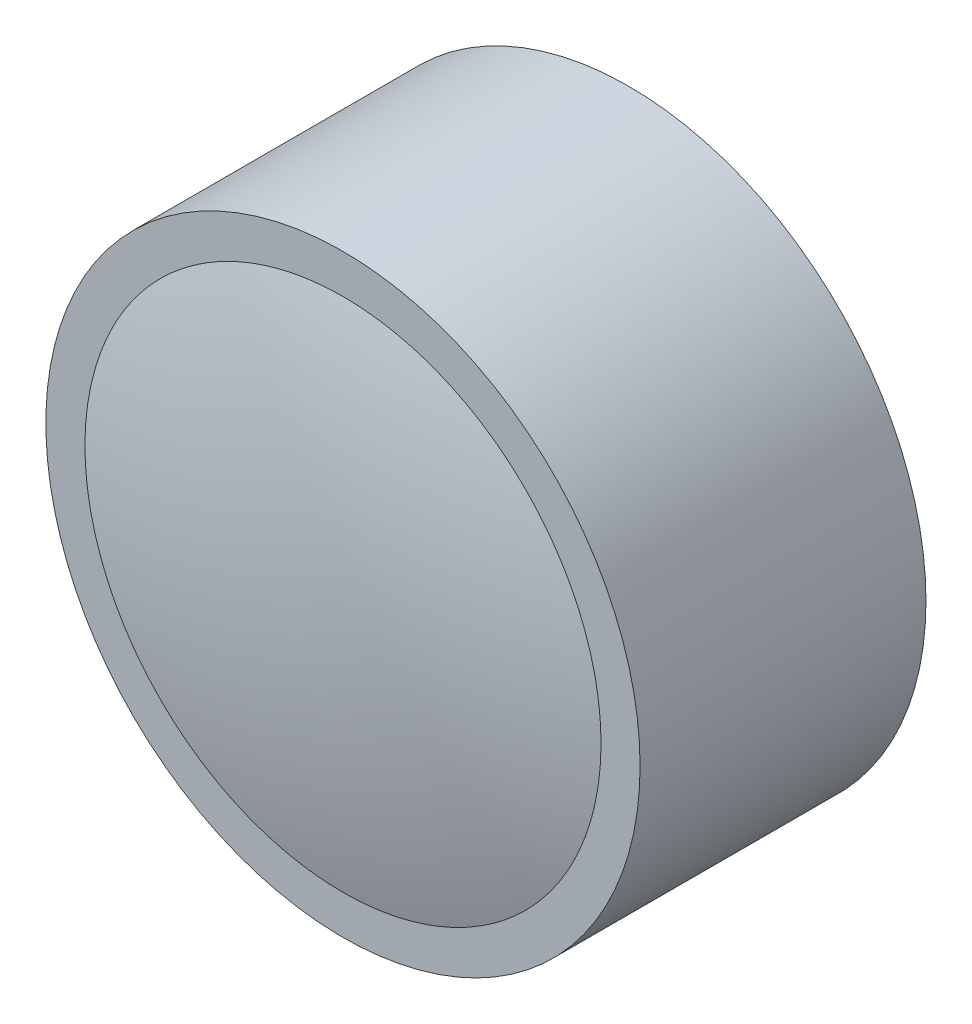
ISO-10303-21;
HEADER;
FILE_DESCRIPTION(('STEP AP214'),'2;1');
FILE_NAME('part.step','',(''),(''),'','','');
FILE_SCHEMA(('AUTOMOTIVE_DESIGN { 1 0 10303 214 1 1 1 1 }'));
ENDSEC;
DATA;
#1=APPLICATION_CONTEXT('core data for automotive mechanical design processes');
#2=APPLICATION_PROTOCOL_DEFINITION('international standard','automotive_design',2000,#1);
#3=PRODUCT_CONTEXT('',#1,'mechanical');
#4=PRODUCT('Part','Part','',(#3));
#5=PRODUCT_RELATED_PRODUCT_CATEGORY('part','',(#4));
#6=PRODUCT_DEFINITION_FORMATION('','',#4);
#7=PRODUCT_DEFINITION_CONTEXT('part definition',#1,'design');
#8=PRODUCT_DEFINITION('design','',#6,#7);
#9=PRODUCT_DEFINITION_SHAPE('','',#8);
#10=(LENGTH_UNIT() NAMED_UNIT(*) SI_UNIT(.MILLI.,.METRE.));
#11=(NAMED_UNIT(*) PLANE_ANGLE_UNIT() SI_UNIT($,.RADIAN.));
#12=(NAMED_UNIT(*) SI_UNIT($,.STERADIAN.) SOLID_ANGLE_UNIT());
#13=UNCERTAINTY_MEASURE_WITH_UNIT(LENGTH_MEASURE(1.E-05),#10,'distance_accuracy_value','');
#14=(GEOMETRIC_REPRESENTATION_CONTEXT(3) GLOBAL_UNCERTAINTY_ASSIGNED_CONTEXT((#13)) GLOBAL_UNIT_ASSIGNED_CONTEXT((#10,
#11,#12)) REPRESENTATION_CONTEXT('',''));
#15=CARTESIAN_POINT('',(0.,0.,0.));
#16=DIRECTION('',(0.,0.,1.));
#17=DIRECTION('',(1.,0.,0.));
#18=AXIS2_PLACEMENT_3D('',#15,#16,#17);
#19=CARTESIAN_POINT('',(0.,0.,0.));
#20=DIRECTION('',(0.,0.,1.));
#21=DIRECTION('',(1.,0.,0.));
#22=AXIS2_PLACEMENT_3D('',#19,#20,#21);
#23=SPHERICAL_SURFACE('',#22,30.);
#24=CARTESIAN_POINT('',(0.,0.,28.7));
#25=DIRECTION('',(0.,0.,1.));
#26=DIRECTION('',(0.,1.,0.));
#27=AXIS2_PLACEMENT_3D('',#24,#25,#26);
#28=CIRCLE('',#27,8.73555951270439);
#29=CARTESIAN_POINT('',(0.,8.73555951270439,28.7));
#30=VERTEX_POINT('',#29);
#31=EDGE_CURVE('P0_E10',#30,#30,#28,.T.);
#32=ORIENTED_EDGE('',*,*,#31,.T.);
#33=EDGE_LOOP('',(#32));
#34=FACE_BOUND('',#33,.T.);
#35=ADVANCED_FACE('P0_F15',(#34),#23,.T.);
#36=CARTESIAN_POINT('',(-38.8893491124261,0.,28.7));
#37=DIRECTION('',(0.,0.,1.));
#38=DIRECTION('',(1.,0.,0.));
#39=AXIS2_PLACEMENT_3D('',#36,#37,#38);
#40=PLANE('',#39);
#41=ORIENTED_EDGE('',*,*,#31,.F.);
#42=EDGE_LOOP('',(#41));
#43=FACE_BOUND('',#42,.T.);
#44=ADVANCED_FACE('P0_F17',(#43),#40,.F.);
#45=CLOSED_SHELL('',(#35,#44));
#46=MANIFOLD_SOLID_BREP('P0_B1',#45);
#47=CARTESIAN_POINT('',(0.,0.,20.));
#48=DIRECTION('',(0.,0.,1.));
#49=DIRECTION('',(1.,0.,0.));
#50=AXIS2_PLACEMENT_3D('',#47,#48,#49);
#51=PLANE('',#50);
#52=CARTESIAN_POINT('',(0.,0.,20.));
#53=DIRECTION('',(0.,0.,1.));
#54=DIRECTION('',(1.,0.,0.));
#55=AXIS2_PLACEMENT_3D('',#52,#53,#54);
#56=CIRCLE('',#55,9.25);
#57=CARTESIAN_POINT('',(9.25,0.,20.));
#58=VERTEX_POINT('',#57);
#59=EDGE_CURVE('P1_E10',#58,#58,#56,.T.);
#60=ORIENTED_EDGE('',*,*,#59,.F.);
#61=EDGE_LOOP('',(#60));
#62=FACE_BOUND('',#61,.T.);
#63=ADVANCED_FACE('P1_F15',(#62),#51,.F.);
#64=CARTESIAN_POINT('',(0.,0.,28.9));
#65=DIRECTION('',(0.,0.,1.));
#66=DIRECTION('',(1.,0.,0.));
#67=AXIS2_PLACEMENT_3D('',#64,#65,#66);
#68=PLANE('',#67);
#69=CARTESIAN_POINT('',(0.,0.,28.9));
#70=DIRECTION('',(0.,0.,1.));
#71=DIRECTION('',(1.,0.,0.));
#72=AXIS2_PLACEMENT_3D('',#69,#70,#71);
#73=CIRCLE('',#72,9.25);
#74=CARTESIAN_POINT('',(9.25,0.,28.9));
#75=VERTEX_POINT('',#74);
#76=EDGE_CURVE('P1_E22',#75,#75,#73,.T.);
#77=ORIENTED_EDGE('',*,*,#76,.T.);
#78=EDGE_LOOP('',(#77));
#79=FACE_BOUND('',#78,.T.);
#80=ADVANCED_FACE('P1_F35',(#79),#68,.T.);
#81=CARTESIAN_POINT('',(0.,0.,20.));
#82=DIRECTION('',(0.,0.,1.));
#83=DIRECTION('',(1.,0.,0.));
#84=AXIS2_PLACEMENT_3D('',#81,#82,#83);
#85=CYLINDRICAL_SURFACE('',#84,9.25);
#86=ORIENTED_EDGE('',*,*,#59,.T.);
#87=EDGE_LOOP('',(#86));
#88=FACE_BOUND('',#87,.T.);
#89=ORIENTED_EDGE('',*,*,#76,.F.);
#90=EDGE_LOOP('',(#89));
#91=FACE_BOUND('',#90,.T.);
#92=ADVANCED_FACE('P1_F37',(#88,#91),#85,.T.);
#93=CLOSED_SHELL('',(#63,#80,#92));
#94=MANIFOLD_SOLID_BREP('P1_B1',#93);
#95=ADVANCED_BREP_SHAPE_REPRESENTATION('',(#18,#46,#94),#14);
#96=SHAPE_DEFINITION_REPRESENTATION(#9,#95);
ENDSEC;
END-ISO-10303-21;
